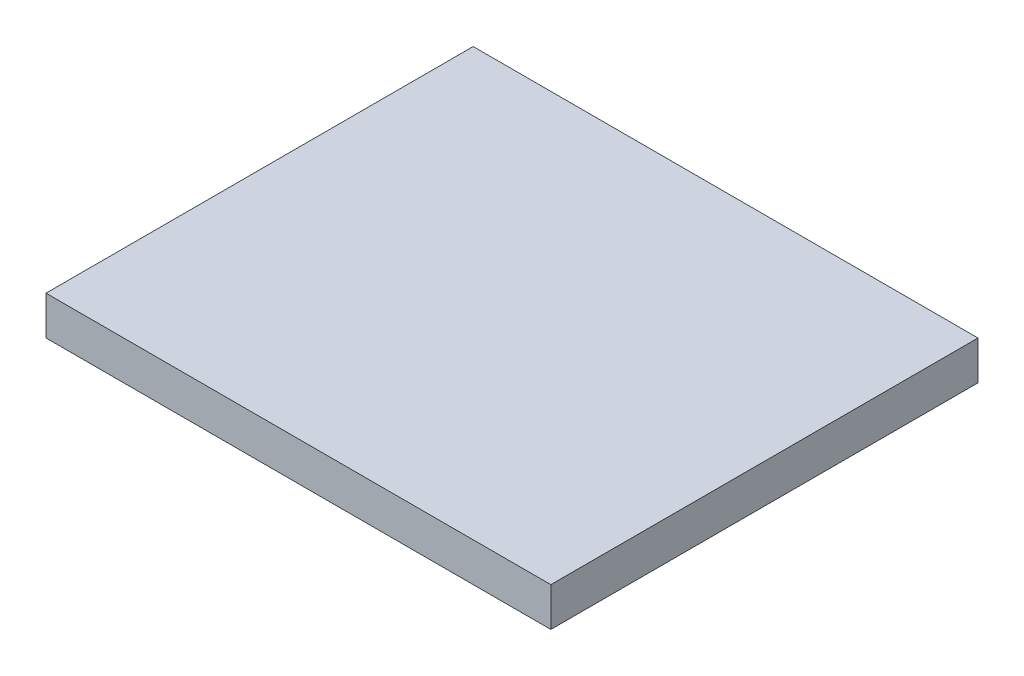
ISO-10303-21;
HEADER;
FILE_DESCRIPTION(('STEP AP214'),'2;1');
FILE_NAME('part.step','',(''),(''),'','','');
FILE_SCHEMA(('AUTOMOTIVE_DESIGN { 1 0 10303 214 1 1 1 1 }'));
ENDSEC;
DATA;
#1=APPLICATION_CONTEXT('core data for automotive mechanical design processes');
#2=APPLICATION_PROTOCOL_DEFINITION('international standard','automotive_design',2000,#1);
#3=PRODUCT_CONTEXT('',#1,'mechanical');
#4=PRODUCT('Part','Part','',(#3));
#5=PRODUCT_RELATED_PRODUCT_CATEGORY('part','',(#4));
#6=PRODUCT_DEFINITION_FORMATION('','',#4);
#7=PRODUCT_DEFINITION_CONTEXT('part definition',#1,'design');
#8=PRODUCT_DEFINITION('design','',#6,#7);
#9=PRODUCT_DEFINITION_SHAPE('','',#8);
#10=(LENGTH_UNIT() NAMED_UNIT(*) SI_UNIT(.MILLI.,.METRE.));
#11=(NAMED_UNIT(*) PLANE_ANGLE_UNIT() SI_UNIT($,.RADIAN.));
#12=(NAMED_UNIT(*) SI_UNIT($,.STERADIAN.) SOLID_ANGLE_UNIT());
#13=UNCERTAINTY_MEASURE_WITH_UNIT(LENGTH_MEASURE(1.E-05),#10,'distance_accuracy_value','');
#14=(GEOMETRIC_REPRESENTATION_CONTEXT(3) GLOBAL_UNCERTAINTY_ASSIGNED_CONTEXT((#13)) GLOBAL_UNIT_ASSIGNED_CONTEXT((#10,
#11,#12)) REPRESENTATION_CONTEXT('',''));
#15=CARTESIAN_POINT('',(0.,0.,0.));
#16=DIRECTION('',(0.,0.,1.));
#17=DIRECTION('',(1.,0.,0.));
#18=AXIS2_PLACEMENT_3D('',#15,#16,#17);
#19=CARTESIAN_POINT('',(-2.7041319491406,3.3756,5.863));
#20=DIRECTION('',(0.,0.,-1.));
#21=DIRECTION('',(-1.,0.,0.));
#22=AXIS2_PLACEMENT_3D('',#19,#20,#21);
#23=PLANE('',#22);
#24=DIRECTION('',(0.,-1.,0.));
#25=VECTOR('',#24,1.);
#26=CARTESIAN_POINT('',(-3.2564,3.3756,5.863));
#27=LINE('',#26,#25);
#28=CARTESIAN_POINT('',(-3.2564,3.3756,5.863));
#29=VERTEX_POINT('',#28);
#30=CARTESIAN_POINT('',(-3.2564,3.3256,5.863));
#31=VERTEX_POINT('',#30);
#32=EDGE_CURVE('E11',#29,#31,#27,.T.);
#33=ORIENTED_EDGE('',*,*,#32,.F.);
#34=DIRECTION('',(-1.,0.,0.));
#35=VECTOR('',#34,1.);
#36=CARTESIAN_POINT('',(-2.7041319491406,3.3756,5.863));
#37=LINE('',#36,#35);
#38=CARTESIAN_POINT('',(-3.9064,3.3756,5.863));
#39=VERTEX_POINT('',#38);
#40=EDGE_CURVE('E24',#29,#39,#37,.T.);
#41=ORIENTED_EDGE('',*,*,#40,.T.);
#42=DIRECTION('',(0.,-1.,0.));
#43=VECTOR('',#42,1.);
#44=CARTESIAN_POINT('',(-3.9064,3.3756,5.863));
#45=LINE('',#44,#43);
#46=CARTESIAN_POINT('',(-3.9064,3.3256,5.863));
#47=VERTEX_POINT('',#46);
#48=EDGE_CURVE('E75',#39,#47,#45,.T.);
#49=ORIENTED_EDGE('',*,*,#48,.T.);
#50=DIRECTION('',(-1.,0.,0.));
#51=VECTOR('',#50,1.);
#52=CARTESIAN_POINT('',(-2.7041319491406,3.3256,5.863));
#53=LINE('',#52,#51);
#54=EDGE_CURVE('E85',#31,#47,#53,.T.);
#55=ORIENTED_EDGE('',*,*,#54,.F.);
#56=EDGE_LOOP('',(#33,#41,#49,#55));
#57=FACE_BOUND('',#56,.T.);
#58=ADVANCED_FACE('F17',(#57),#23,.F.);
#59=CARTESIAN_POINT('',(-2.7041319491406,3.3256,5.863));
#60=DIRECTION('',(0.,1.,0.));
#61=DIRECTION('',(-1.,0.,0.));
#62=AXIS2_PLACEMENT_3D('',#59,#60,#61);
#63=PLANE('',#62);
#64=DIRECTION('',(0.,0.,-1.));
#65=VECTOR('',#64,1.);
#66=CARTESIAN_POINT('',(-3.2564,3.3256,5.863));
#67=LINE('',#66,#65);
#68=CARTESIAN_POINT('',(-3.2564,3.3256,5.313));
#69=VERTEX_POINT('',#68);
#70=EDGE_CURVE('E83',#31,#69,#67,.T.);
#71=ORIENTED_EDGE('',*,*,#70,.F.);
#72=ORIENTED_EDGE('',*,*,#54,.T.);
#73=DIRECTION('',(0.,0.,-1.));
#74=VECTOR('',#73,1.);
#75=CARTESIAN_POINT('',(-3.9064,3.3256,5.863));
#76=LINE('',#75,#74);
#77=CARTESIAN_POINT('',(-3.9064,3.3256,5.313));
#78=VERTEX_POINT('',#77);
#79=EDGE_CURVE('E81',#47,#78,#76,.T.);
#80=ORIENTED_EDGE('',*,*,#79,.T.);
#81=DIRECTION('',(-1.,0.,0.));
#82=VECTOR('',#81,1.);
#83=CARTESIAN_POINT('',(-2.7041319491406,3.3256,5.313));
#84=LINE('',#83,#82);
#85=EDGE_CURVE('E61',#69,#78,#84,.T.);
#86=ORIENTED_EDGE('',*,*,#85,.F.);
#87=EDGE_LOOP('',(#71,#72,#80,#86));
#88=FACE_BOUND('',#87,.T.);
#89=ADVANCED_FACE('F91',(#88),#63,.F.);
#90=CARTESIAN_POINT('',(-2.7041319491406,3.3756,5.313));
#91=DIRECTION('',(0.,0.,1.));
#92=DIRECTION('',(1.,0.,0.));
#93=AXIS2_PLACEMENT_3D('',#90,#91,#92);
#94=PLANE('',#93);
#95=DIRECTION('',(0.,1.,0.));
#96=VECTOR('',#95,1.);
#97=CARTESIAN_POINT('',(-3.2564,3.3756,5.313));
#98=LINE('',#97,#96);
#99=CARTESIAN_POINT('',(-3.2564,3.3756,5.313));
#100=VERTEX_POINT('',#99);
#101=EDGE_CURVE('E65',#69,#100,#98,.T.);
#102=ORIENTED_EDGE('',*,*,#101,.F.);
#103=ORIENTED_EDGE('',*,*,#85,.T.);
#104=DIRECTION('',(0.,1.,0.));
#105=VECTOR('',#104,1.);
#106=CARTESIAN_POINT('',(-3.9064,3.3756,5.313));
#107=LINE('',#106,#105);
#108=CARTESIAN_POINT('',(-3.9064,3.3756,5.313));
#109=VERTEX_POINT('',#108);
#110=EDGE_CURVE('E54',#78,#109,#107,.T.);
#111=ORIENTED_EDGE('',*,*,#110,.T.);
#112=DIRECTION('',(-1.,0.,0.));
#113=VECTOR('',#112,1.);
#114=CARTESIAN_POINT('',(-2.7041319491406,3.3756,5.313));
#115=LINE('',#114,#113);
#116=EDGE_CURVE('E58',#100,#109,#115,.T.);
#117=ORIENTED_EDGE('',*,*,#116,.F.);
#118=EDGE_LOOP('',(#102,#103,#111,#117));
#119=FACE_BOUND('',#118,.T.);
#120=ADVANCED_FACE('F57',(#119),#94,.F.);
#121=CARTESIAN_POINT('',(-2.7041319491406,3.3756,5.863));
#122=DIRECTION('',(0.,-1.,0.));
#123=DIRECTION('',(1.,0.,0.));
#124=AXIS2_PLACEMENT_3D('',#121,#122,#123);
#125=PLANE('',#124);
#126=DIRECTION('',(0.,0.,1.));
#127=VECTOR('',#126,1.);
#128=CARTESIAN_POINT('',(-3.2564,3.3756,5.863));
#129=LINE('',#128,#127);
#130=EDGE_CURVE('E71',#100,#29,#129,.T.);
#131=ORIENTED_EDGE('',*,*,#130,.F.);
#132=ORIENTED_EDGE('',*,*,#116,.T.);
#133=DIRECTION('',(0.,0.,1.));
#134=VECTOR('',#133,1.);
#135=CARTESIAN_POINT('',(-3.9064,3.3756,5.863));
#136=LINE('',#135,#134);
#137=EDGE_CURVE('E70',#109,#39,#136,.T.);
#138=ORIENTED_EDGE('',*,*,#137,.T.);
#139=ORIENTED_EDGE('',*,*,#40,.F.);
#140=EDGE_LOOP('',(#131,#132,#138,#139));
#141=FACE_BOUND('',#140,.T.);
#142=ADVANCED_FACE('F69',(#141),#125,.F.);
#143=CARTESIAN_POINT('',(-3.9064,3.3256,5.863));
#144=DIRECTION('',(1.,0.,0.));
#145=DIRECTION('',(0.,0.,-1.));
#146=AXIS2_PLACEMENT_3D('',#143,#144,#145);
#147=PLANE('',#146);
#148=ORIENTED_EDGE('',*,*,#48,.F.);
#149=ORIENTED_EDGE('',*,*,#137,.F.);
#150=ORIENTED_EDGE('',*,*,#110,.F.);
#151=ORIENTED_EDGE('',*,*,#79,.F.);
#152=EDGE_LOOP('',(#148,#149,#150,#151));
#153=FACE_BOUND('',#152,.T.);
#154=ADVANCED_FACE('F74',(#153),#147,.F.);
#155=CARTESIAN_POINT('',(-3.2564,3.3756,5.863));
#156=DIRECTION('',(1.,0.,0.));
#157=DIRECTION('',(0.,0.,1.));
#158=AXIS2_PLACEMENT_3D('',#155,#156,#157);
#159=PLANE('',#158);
#160=ORIENTED_EDGE('',*,*,#130,.T.);
#161=ORIENTED_EDGE('',*,*,#32,.T.);
#162=ORIENTED_EDGE('',*,*,#70,.T.);
#163=ORIENTED_EDGE('',*,*,#101,.T.);
#164=EDGE_LOOP('',(#160,#161,#162,#163));
#165=FACE_BOUND('',#164,.T.);
#166=ADVANCED_FACE('F88',(#165),#159,.T.);
#167=CLOSED_SHELL('',(#58,#89,#120,#142,#154,#166));
#168=MANIFOLD_SOLID_BREP('B1',#167);
#169=ADVANCED_BREP_SHAPE_REPRESENTATION('',(#18,#168),#14);
#170=SHAPE_DEFINITION_REPRESENTATION(#9,#169);
ENDSEC;
END-ISO-10303-21;
